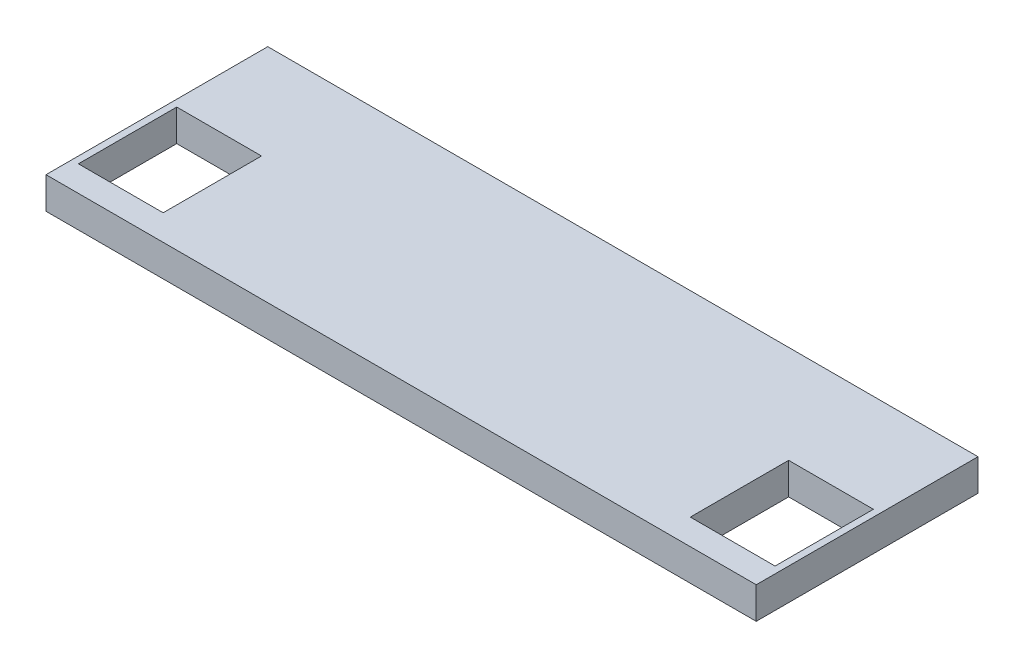
ISO-10303-21;
HEADER;
FILE_DESCRIPTION(('STEP AP214'),'2;1');
FILE_NAME('part.step','',(''),(''),'','','');
FILE_SCHEMA(('AUTOMOTIVE_DESIGN { 1 0 10303 214 1 1 1 1 }'));
ENDSEC;
DATA;
#1=APPLICATION_CONTEXT('core data for automotive mechanical design processes');
#2=APPLICATION_PROTOCOL_DEFINITION('international standard','automotive_design',2000,#1);
#3=PRODUCT_CONTEXT('',#1,'mechanical');
#4=PRODUCT('Part','Part','',(#3));
#5=PRODUCT_RELATED_PRODUCT_CATEGORY('part','',(#4));
#6=PRODUCT_DEFINITION_FORMATION('','',#4);
#7=PRODUCT_DEFINITION_CONTEXT('part definition',#1,'design');
#8=PRODUCT_DEFINITION('design','',#6,#7);
#9=PRODUCT_DEFINITION_SHAPE('','',#8);
#10=(LENGTH_UNIT() NAMED_UNIT(*) SI_UNIT(.MILLI.,.METRE.));
#11=(NAMED_UNIT(*) PLANE_ANGLE_UNIT() SI_UNIT($,.RADIAN.));
#12=(NAMED_UNIT(*) SI_UNIT($,.STERADIAN.) SOLID_ANGLE_UNIT());
#13=UNCERTAINTY_MEASURE_WITH_UNIT(LENGTH_MEASURE(1.E-05),#10,'distance_accuracy_value','');
#14=(GEOMETRIC_REPRESENTATION_CONTEXT(3) GLOBAL_UNCERTAINTY_ASSIGNED_CONTEXT((#13)) GLOBAL_UNIT_ASSIGNED_CONTEXT((#10,
#11,#12)) REPRESENTATION_CONTEXT('',''));
#15=CARTESIAN_POINT('',(0.,0.,0.));
#16=DIRECTION('',(0.,0.,1.));
#17=DIRECTION('',(1.,0.,0.));
#18=AXIS2_PLACEMENT_3D('',#15,#16,#17);
#19=CARTESIAN_POINT('',(0.,2.3749,0.));
#20=DIRECTION('',(0.,1.,0.));
#21=DIRECTION('',(0.,0.,1.));
#22=AXIS2_PLACEMENT_3D('',#19,#20,#21);
#23=PLANE('',#22);
#24=DIRECTION('',(0.,0.,-1.));
#25=VECTOR('',#24,1.);
#26=CARTESIAN_POINT('',(19.74215,2.3749,0.));
#27=LINE('',#26,#25);
#28=CARTESIAN_POINT('',(19.74215,2.3749,-1.91896999999999));
#29=VERTEX_POINT('',#28);
#30=CARTESIAN_POINT('',(19.74215,2.3749,-9.28496999999999));
#31=VERTEX_POINT('',#30);
#32=EDGE_CURVE('E263',#29,#31,#27,.T.);
#33=ORIENTED_EDGE('',*,*,#32,.T.);
#34=DIRECTION('',(1.,0.,0.));
#35=VECTOR('',#34,1.);
#36=CARTESIAN_POINT('',(0.,2.3749,-9.28496999999999));
#37=LINE('',#36,#35);
#38=CARTESIAN_POINT('',(26.09215,2.3749,-9.28496999999999));
#39=VERTEX_POINT('',#38);
#40=EDGE_CURVE('E273',#31,#39,#37,.T.);
#41=ORIENTED_EDGE('',*,*,#40,.T.);
#42=DIRECTION('',(0.,0.,-1.));
#43=VECTOR('',#42,1.);
#44=CARTESIAN_POINT('',(26.09215,2.3749,0.));
#45=LINE('',#44,#43);
#46=CARTESIAN_POINT('',(26.09215,2.3749,-1.91896999999999));
#47=VERTEX_POINT('',#46);
#48=EDGE_CURVE('E267',#47,#39,#45,.T.);
#49=ORIENTED_EDGE('',*,*,#48,.F.);
#50=DIRECTION('',(1.,0.,0.));
#51=VECTOR('',#50,1.);
#52=CARTESIAN_POINT('',(0.,2.3749,-1.91896999999999));
#53=LINE('',#52,#51);
#54=EDGE_CURVE('E262',#29,#47,#53,.T.);
#55=ORIENTED_EDGE('',*,*,#54,.F.);
#56=EDGE_LOOP('',(#33,#41,#49,#55));
#57=FACE_BOUND('',#56,.T.);
#58=DIRECTION('',(0.,0.,-1.));
#59=VECTOR('',#58,1.);
#60=CARTESIAN_POINT('',(26.60015,2.3749,0.));
#61=LINE('',#60,#59);
#62=CARTESIAN_POINT('',(26.60015,2.3749,0.));
#63=VERTEX_POINT('',#62);
#64=CARTESIAN_POINT('',(26.60015,2.3749,-16.6116));
#65=VERTEX_POINT('',#64);
#66=EDGE_CURVE('E305',#63,#65,#61,.T.);
#67=ORIENTED_EDGE('',*,*,#66,.T.);
#68=DIRECTION('',(-1.,0.,0.));
#69=VECTOR('',#68,1.);
#70=CARTESIAN_POINT('',(26.60015,2.3749,-16.6116));
#71=LINE('',#70,#69);
#72=CARTESIAN_POINT('',(-26.60015,2.3749,-16.6116));
#73=VERTEX_POINT('',#72);
#74=EDGE_CURVE('E306',#65,#73,#71,.T.);
#75=ORIENTED_EDGE('',*,*,#74,.T.);
#76=DIRECTION('',(0.,0.,1.));
#77=VECTOR('',#76,1.);
#78=CARTESIAN_POINT('',(-26.60015,2.3749,-16.6116));
#79=LINE('',#78,#77);
#80=CARTESIAN_POINT('',(-26.60015,2.3749,0.));
#81=VERTEX_POINT('',#80);
#82=EDGE_CURVE('E315',#73,#81,#79,.T.);
#83=ORIENTED_EDGE('',*,*,#82,.T.);
#84=DIRECTION('',(1.,0.,0.));
#85=VECTOR('',#84,1.);
#86=CARTESIAN_POINT('',(-26.60015,2.3749,0.));
#87=LINE('',#86,#85);
#88=EDGE_CURVE('E314',#81,#63,#87,.T.);
#89=ORIENTED_EDGE('',*,*,#88,.T.);
#90=EDGE_LOOP('',(#67,#75,#83,#89));
#91=FACE_BOUND('',#90,.T.);
#92=DIRECTION('',(-1.,0.,0.));
#93=VECTOR('',#92,1.);
#94=CARTESIAN_POINT('',(0.,2.3749,-9.28496999999999));
#95=LINE('',#94,#93);
#96=CARTESIAN_POINT('',(-19.74215,2.3749,-9.28496999999999));
#97=VERTEX_POINT('',#96);
#98=CARTESIAN_POINT('',(-26.09215,2.3749,-9.28496999999999));
#99=VERTEX_POINT('',#98);
#100=EDGE_CURVE('E223',#97,#99,#95,.T.);
#101=ORIENTED_EDGE('',*,*,#100,.F.);
#102=DIRECTION('',(0.,0.,-1.));
#103=VECTOR('',#102,1.);
#104=CARTESIAN_POINT('',(-19.74215,2.3749,0.));
#105=LINE('',#104,#103);
#106=CARTESIAN_POINT('',(-19.74215,2.3749,-1.91896999999999));
#107=VERTEX_POINT('',#106);
#108=EDGE_CURVE('E211',#107,#97,#105,.T.);
#109=ORIENTED_EDGE('',*,*,#108,.F.);
#110=DIRECTION('',(-1.,0.,0.));
#111=VECTOR('',#110,1.);
#112=CARTESIAN_POINT('',(0.,2.3749,-1.91896999999999));
#113=LINE('',#112,#111);
#114=CARTESIAN_POINT('',(-26.09215,2.3749,-1.91896999999999));
#115=VERTEX_POINT('',#114);
#116=EDGE_CURVE('E239',#107,#115,#113,.T.);
#117=ORIENTED_EDGE('',*,*,#116,.T.);
#118=DIRECTION('',(0.,0.,-1.));
#119=VECTOR('',#118,1.);
#120=CARTESIAN_POINT('',(-26.09215,2.3749,0.));
#121=LINE('',#120,#119);
#122=EDGE_CURVE('E137',#115,#99,#121,.T.);
#123=ORIENTED_EDGE('',*,*,#122,.T.);
#124=EDGE_LOOP('',(#101,#109,#117,#123));
#125=FACE_BOUND('',#124,.T.);
#126=ADVANCED_FACE('F121',(#57,#91,#125),#23,.T.);
#127=CARTESIAN_POINT('',(0.,0.,0.));
#128=DIRECTION('',(0.,1.,0.));
#129=DIRECTION('',(0.,0.,1.));
#130=AXIS2_PLACEMENT_3D('',#127,#128,#129);
#131=PLANE('',#130);
#132=DIRECTION('',(0.,0.,-1.));
#133=VECTOR('',#132,1.);
#134=CARTESIAN_POINT('',(26.60015,0.,0.));
#135=LINE('',#134,#133);
#136=CARTESIAN_POINT('',(26.60015,0.,0.));
#137=VERTEX_POINT('',#136);
#138=CARTESIAN_POINT('',(26.60015,0.,-16.6116));
#139=VERTEX_POINT('',#138);
#140=EDGE_CURVE('E301',#137,#139,#135,.T.);
#141=ORIENTED_EDGE('',*,*,#140,.F.);
#142=DIRECTION('',(1.,0.,0.));
#143=VECTOR('',#142,1.);
#144=CARTESIAN_POINT('',(-26.60015,0.,0.));
#145=LINE('',#144,#143);
#146=CARTESIAN_POINT('',(-26.60015,0.,0.));
#147=VERTEX_POINT('',#146);
#148=EDGE_CURVE('E309',#147,#137,#145,.T.);
#149=ORIENTED_EDGE('',*,*,#148,.F.);
#150=DIRECTION('',(0.,0.,1.));
#151=VECTOR('',#150,1.);
#152=CARTESIAN_POINT('',(-26.60015,0.,-16.6116));
#153=LINE('',#152,#151);
#154=CARTESIAN_POINT('',(-26.60015,0.,-16.6116));
#155=VERTEX_POINT('',#154);
#156=EDGE_CURVE('E324',#155,#147,#153,.T.);
#157=ORIENTED_EDGE('',*,*,#156,.F.);
#158=DIRECTION('',(-1.,0.,0.));
#159=VECTOR('',#158,1.);
#160=CARTESIAN_POINT('',(26.60015,0.,-16.6116));
#161=LINE('',#160,#159);
#162=EDGE_CURVE('E325',#139,#155,#161,.T.);
#163=ORIENTED_EDGE('',*,*,#162,.F.);
#164=EDGE_LOOP('',(#141,#149,#157,#163));
#165=FACE_BOUND('',#164,.T.);
#166=DIRECTION('',(1.,0.,0.));
#167=VECTOR('',#166,1.);
#168=CARTESIAN_POINT('',(0.,0.,-9.28496999999999));
#169=LINE('',#168,#167);
#170=CARTESIAN_POINT('',(19.74215,0.,-9.28496999999999));
#171=VERTEX_POINT('',#170);
#172=CARTESIAN_POINT('',(26.09215,0.,-9.28496999999999));
#173=VERTEX_POINT('',#172);
#174=EDGE_CURVE('E266',#171,#173,#169,.T.);
#175=ORIENTED_EDGE('',*,*,#174,.F.);
#176=DIRECTION('',(0.,0.,-1.));
#177=VECTOR('',#176,1.);
#178=CARTESIAN_POINT('',(19.74215,0.,0.));
#179=LINE('',#178,#177);
#180=CARTESIAN_POINT('',(19.74215,0.,-1.91896999999999));
#181=VERTEX_POINT('',#180);
#182=EDGE_CURVE('E231',#181,#171,#179,.T.);
#183=ORIENTED_EDGE('',*,*,#182,.F.);
#184=DIRECTION('',(1.,0.,0.));
#185=VECTOR('',#184,1.);
#186=CARTESIAN_POINT('',(0.,0.,-1.91896999999999));
#187=LINE('',#186,#185);
#188=CARTESIAN_POINT('',(26.09215,0.,-1.91896999999999));
#189=VERTEX_POINT('',#188);
#190=EDGE_CURVE('E279',#181,#189,#187,.T.);
#191=ORIENTED_EDGE('',*,*,#190,.T.);
#192=DIRECTION('',(0.,0.,-1.));
#193=VECTOR('',#192,1.);
#194=CARTESIAN_POINT('',(26.09215,0.,0.));
#195=LINE('',#194,#193);
#196=EDGE_CURVE('E281',#189,#173,#195,.T.);
#197=ORIENTED_EDGE('',*,*,#196,.T.);
#198=EDGE_LOOP('',(#175,#183,#191,#197));
#199=FACE_BOUND('',#198,.T.);
#200=DIRECTION('',(0.,0.,-1.));
#201=VECTOR('',#200,1.);
#202=CARTESIAN_POINT('',(-19.74215,0.,0.));
#203=LINE('',#202,#201);
#204=CARTESIAN_POINT('',(-19.74215,0.,-1.91896999999999));
#205=VERTEX_POINT('',#204);
#206=CARTESIAN_POINT('',(-19.74215,0.,-9.28496999999999));
#207=VERTEX_POINT('',#206);
#208=EDGE_CURVE('E150',#205,#207,#203,.T.);
#209=ORIENTED_EDGE('',*,*,#208,.T.);
#210=DIRECTION('',(-1.,0.,0.));
#211=VECTOR('',#210,1.);
#212=CARTESIAN_POINT('',(0.,0.,-9.28496999999999));
#213=LINE('',#212,#211);
#214=CARTESIAN_POINT('',(-26.09215,0.,-9.28496999999999));
#215=VERTEX_POINT('',#214);
#216=EDGE_CURVE('E227',#207,#215,#213,.T.);
#217=ORIENTED_EDGE('',*,*,#216,.T.);
#218=DIRECTION('',(0.,0.,-1.));
#219=VECTOR('',#218,1.);
#220=CARTESIAN_POINT('',(-26.09215,0.,0.));
#221=LINE('',#220,#219);
#222=CARTESIAN_POINT('',(-26.09215,0.,-1.91896999999999));
#223=VERTEX_POINT('',#222);
#224=EDGE_CURVE('E250',#223,#215,#221,.T.);
#225=ORIENTED_EDGE('',*,*,#224,.F.);
#226=DIRECTION('',(-1.,0.,0.));
#227=VECTOR('',#226,1.);
#228=CARTESIAN_POINT('',(0.,0.,-1.91896999999999));
#229=LINE('',#228,#227);
#230=EDGE_CURVE('E222',#205,#223,#229,.T.);
#231=ORIENTED_EDGE('',*,*,#230,.F.);
#232=EDGE_LOOP('',(#209,#217,#225,#231));
#233=FACE_BOUND('',#232,.T.);
#234=ADVANCED_FACE('F350',(#165,#199,#233),#131,.F.);
#235=CARTESIAN_POINT('',(26.60015,2.3749,0.));
#236=DIRECTION('',(-1.,0.,0.));
#237=DIRECTION('',(0.,0.,1.));
#238=AXIS2_PLACEMENT_3D('',#235,#236,#237);
#239=PLANE('',#238);
#240=ORIENTED_EDGE('',*,*,#140,.T.);
#241=DIRECTION('',(0.,-1.,0.));
#242=VECTOR('',#241,1.);
#243=CARTESIAN_POINT('',(26.60015,2.3749,-16.6116));
#244=LINE('',#243,#242);
#245=EDGE_CURVE('E12',#65,#139,#244,.T.);
#246=ORIENTED_EDGE('',*,*,#245,.F.);
#247=ORIENTED_EDGE('',*,*,#66,.F.);
#248=DIRECTION('',(0.,-1.,0.));
#249=VECTOR('',#248,1.);
#250=CARTESIAN_POINT('',(26.60015,2.3749,0.));
#251=LINE('',#250,#249);
#252=EDGE_CURVE('E318',#63,#137,#251,.T.);
#253=ORIENTED_EDGE('',*,*,#252,.T.);
#254=EDGE_LOOP('',(#240,#246,#247,#253));
#255=FACE_BOUND('',#254,.T.);
#256=ADVANCED_FACE('F124',(#255),#239,.F.);
#257=CARTESIAN_POINT('',(26.60015,2.3749,-16.6116));
#258=DIRECTION('',(0.,0.,1.));
#259=DIRECTION('',(1.,0.,0.));
#260=AXIS2_PLACEMENT_3D('',#257,#258,#259);
#261=PLANE('',#260);
#262=ORIENTED_EDGE('',*,*,#162,.T.);
#263=DIRECTION('',(0.,-1.,0.));
#264=VECTOR('',#263,1.);
#265=CARTESIAN_POINT('',(-26.60015,2.3749,-16.6116));
#266=LINE('',#265,#264);
#267=EDGE_CURVE('E135',#73,#155,#266,.T.);
#268=ORIENTED_EDGE('',*,*,#267,.F.);
#269=ORIENTED_EDGE('',*,*,#74,.F.);
#270=ORIENTED_EDGE('',*,*,#245,.T.);
#271=EDGE_LOOP('',(#262,#268,#269,#270));
#272=FACE_BOUND('',#271,.T.);
#273=ADVANCED_FACE('F357',(#272),#261,.F.);
#274=CARTESIAN_POINT('',(-26.60015,2.3749,-16.6116));
#275=DIRECTION('',(1.,0.,0.));
#276=DIRECTION('',(0.,0.,-1.));
#277=AXIS2_PLACEMENT_3D('',#274,#275,#276);
#278=PLANE('',#277);
#279=ORIENTED_EDGE('',*,*,#156,.T.);
#280=DIRECTION('',(0.,-1.,0.));
#281=VECTOR('',#280,1.);
#282=CARTESIAN_POINT('',(-26.60015,2.3749,0.));
#283=LINE('',#282,#281);
#284=EDGE_CURVE('E331',#81,#147,#283,.T.);
#285=ORIENTED_EDGE('',*,*,#284,.F.);
#286=ORIENTED_EDGE('',*,*,#82,.F.);
#287=ORIENTED_EDGE('',*,*,#267,.T.);
#288=EDGE_LOOP('',(#279,#285,#286,#287));
#289=FACE_BOUND('',#288,.T.);
#290=ADVANCED_FACE('F341',(#289),#278,.F.);
#291=CARTESIAN_POINT('',(-26.60015,2.3749,0.));
#292=DIRECTION('',(0.,0.,-1.));
#293=DIRECTION('',(-1.,0.,0.));
#294=AXIS2_PLACEMENT_3D('',#291,#292,#293);
#295=PLANE('',#294);
#296=ORIENTED_EDGE('',*,*,#148,.T.);
#297=ORIENTED_EDGE('',*,*,#252,.F.);
#298=ORIENTED_EDGE('',*,*,#88,.F.);
#299=ORIENTED_EDGE('',*,*,#284,.T.);
#300=EDGE_LOOP('',(#296,#297,#298,#299));
#301=FACE_BOUND('',#300,.T.);
#302=ADVANCED_FACE('F351',(#301),#295,.F.);
#303=CARTESIAN_POINT('',(19.74215,2.3749,0.));
#304=DIRECTION('',(-1.,0.,0.));
#305=DIRECTION('',(0.,0.,1.));
#306=AXIS2_PLACEMENT_3D('',#303,#304,#305);
#307=PLANE('',#306);
#308=ORIENTED_EDGE('',*,*,#182,.T.);
#309=DIRECTION('',(0.,-1.,0.));
#310=VECTOR('',#309,1.);
#311=CARTESIAN_POINT('',(19.74215,2.3749,-9.28496999999999));
#312=LINE('',#311,#310);
#313=EDGE_CURVE('E280',#31,#171,#312,.T.);
#314=ORIENTED_EDGE('',*,*,#313,.F.);
#315=ORIENTED_EDGE('',*,*,#32,.F.);
#316=DIRECTION('',(0.,-1.,0.));
#317=VECTOR('',#316,1.);
#318=CARTESIAN_POINT('',(19.74215,2.3749,-1.91896999999999));
#319=LINE('',#318,#317);
#320=EDGE_CURVE('E299',#29,#181,#319,.T.);
#321=ORIENTED_EDGE('',*,*,#320,.T.);
#322=EDGE_LOOP('',(#308,#314,#315,#321));
#323=FACE_BOUND('',#322,.T.);
#324=ADVANCED_FACE('F371',(#323),#307,.F.);
#325=CARTESIAN_POINT('',(0.,2.3749,-1.91896999999999));
#326=DIRECTION('',(0.,0.,-1.));
#327=DIRECTION('',(-1.,0.,0.));
#328=AXIS2_PLACEMENT_3D('',#325,#326,#327);
#329=PLANE('',#328);
#330=ORIENTED_EDGE('',*,*,#190,.F.);
#331=ORIENTED_EDGE('',*,*,#320,.F.);
#332=ORIENTED_EDGE('',*,*,#54,.T.);
#333=DIRECTION('',(0.,-1.,0.));
#334=VECTOR('',#333,1.);
#335=CARTESIAN_POINT('',(26.09215,2.3749,-1.91896999999999));
#336=LINE('',#335,#334);
#337=EDGE_CURVE('E300',#47,#189,#336,.T.);
#338=ORIENTED_EDGE('',*,*,#337,.T.);
#339=EDGE_LOOP('',(#330,#331,#332,#338));
#340=FACE_BOUND('',#339,.T.);
#341=ADVANCED_FACE('F382',(#340),#329,.T.);
#342=CARTESIAN_POINT('',(26.09215,2.3749,0.));
#343=DIRECTION('',(-1.,0.,0.));
#344=DIRECTION('',(0.,0.,1.));
#345=AXIS2_PLACEMENT_3D('',#342,#343,#344);
#346=PLANE('',#345);
#347=ORIENTED_EDGE('',*,*,#196,.F.);
#348=ORIENTED_EDGE('',*,*,#337,.F.);
#349=ORIENTED_EDGE('',*,*,#48,.T.);
#350=DIRECTION('',(0.,-1.,0.));
#351=VECTOR('',#350,1.);
#352=CARTESIAN_POINT('',(26.09215,2.3749,-9.28496999999999));
#353=LINE('',#352,#351);
#354=EDGE_CURVE('E294',#39,#173,#353,.T.);
#355=ORIENTED_EDGE('',*,*,#354,.T.);
#356=EDGE_LOOP('',(#347,#348,#349,#355));
#357=FACE_BOUND('',#356,.T.);
#358=ADVANCED_FACE('F388',(#357),#346,.T.);
#359=CARTESIAN_POINT('',(0.,2.3749,-9.28496999999999));
#360=DIRECTION('',(0.,0.,-1.));
#361=DIRECTION('',(-1.,0.,0.));
#362=AXIS2_PLACEMENT_3D('',#359,#360,#361);
#363=PLANE('',#362);
#364=ORIENTED_EDGE('',*,*,#174,.T.);
#365=ORIENTED_EDGE('',*,*,#354,.F.);
#366=ORIENTED_EDGE('',*,*,#40,.F.);
#367=ORIENTED_EDGE('',*,*,#313,.T.);
#368=EDGE_LOOP('',(#364,#365,#366,#367));
#369=FACE_BOUND('',#368,.T.);
#370=ADVANCED_FACE('F395',(#369),#363,.F.);
#371=CARTESIAN_POINT('',(-19.74215,2.3749,0.));
#372=DIRECTION('',(-1.,0.,0.));
#373=DIRECTION('',(0.,0.,1.));
#374=AXIS2_PLACEMENT_3D('',#371,#372,#373);
#375=PLANE('',#374);
#376=ORIENTED_EDGE('',*,*,#208,.F.);
#377=DIRECTION('',(0.,-1.,0.));
#378=VECTOR('',#377,1.);
#379=CARTESIAN_POINT('',(-19.74215,2.3749,-1.91896999999999));
#380=LINE('',#379,#378);
#381=EDGE_CURVE('E220',#107,#205,#380,.T.);
#382=ORIENTED_EDGE('',*,*,#381,.F.);
#383=ORIENTED_EDGE('',*,*,#108,.T.);
#384=DIRECTION('',(0.,-1.,0.));
#385=VECTOR('',#384,1.);
#386=CARTESIAN_POINT('',(-19.74215,2.3749,-9.28496999999999));
#387=LINE('',#386,#385);
#388=EDGE_CURVE('E218',#97,#207,#387,.T.);
#389=ORIENTED_EDGE('',*,*,#388,.T.);
#390=EDGE_LOOP('',(#376,#382,#383,#389));
#391=FACE_BOUND('',#390,.T.);
#392=ADVANCED_FACE('F214',(#391),#375,.T.);
#393=CARTESIAN_POINT('',(0.,2.3749,-9.28496999999999));
#394=DIRECTION('',(0.,0.,1.));
#395=DIRECTION('',(1.,0.,0.));
#396=AXIS2_PLACEMENT_3D('',#393,#394,#395);
#397=PLANE('',#396);
#398=ORIENTED_EDGE('',*,*,#216,.F.);
#399=ORIENTED_EDGE('',*,*,#388,.F.);
#400=ORIENTED_EDGE('',*,*,#100,.T.);
#401=DIRECTION('',(0.,-1.,0.));
#402=VECTOR('',#401,1.);
#403=CARTESIAN_POINT('',(-26.09215,2.3749,-9.28496999999999));
#404=LINE('',#403,#402);
#405=EDGE_CURVE('E235',#99,#215,#404,.T.);
#406=ORIENTED_EDGE('',*,*,#405,.T.);
#407=EDGE_LOOP('',(#398,#399,#400,#406));
#408=FACE_BOUND('',#407,.T.);
#409=ADVANCED_FACE('F230',(#408),#397,.T.);
#410=CARTESIAN_POINT('',(-26.09215,2.3749,0.));
#411=DIRECTION('',(-1.,0.,0.));
#412=DIRECTION('',(0.,0.,1.));
#413=AXIS2_PLACEMENT_3D('',#410,#411,#412);
#414=PLANE('',#413);
#415=ORIENTED_EDGE('',*,*,#224,.T.);
#416=ORIENTED_EDGE('',*,*,#405,.F.);
#417=ORIENTED_EDGE('',*,*,#122,.F.);
#418=DIRECTION('',(0.,-1.,0.));
#419=VECTOR('',#418,1.);
#420=CARTESIAN_POINT('',(-26.09215,2.3749,-1.91896999999999));
#421=LINE('',#420,#419);
#422=EDGE_CURVE('E258',#115,#223,#421,.T.);
#423=ORIENTED_EDGE('',*,*,#422,.T.);
#424=EDGE_LOOP('',(#415,#416,#417,#423));
#425=FACE_BOUND('',#424,.T.);
#426=ADVANCED_FACE('F415',(#425),#414,.F.);
#427=CARTESIAN_POINT('',(0.,2.3749,-1.91896999999999));
#428=DIRECTION('',(0.,0.,1.));
#429=DIRECTION('',(1.,0.,0.));
#430=AXIS2_PLACEMENT_3D('',#427,#428,#429);
#431=PLANE('',#430);
#432=ORIENTED_EDGE('',*,*,#230,.T.);
#433=ORIENTED_EDGE('',*,*,#422,.F.);
#434=ORIENTED_EDGE('',*,*,#116,.F.);
#435=ORIENTED_EDGE('',*,*,#381,.T.);
#436=EDGE_LOOP('',(#432,#433,#434,#435));
#437=FACE_BOUND('',#436,.T.);
#438=ADVANCED_FACE('F414',(#437),#431,.F.);
#439=CLOSED_SHELL('',(#126,#234,#256,#273,#290,#302,#324,#341,#358,#370,#392,#409,#426,#438));
#440=MANIFOLD_SOLID_BREP('B2',#439);
#441=ADVANCED_BREP_SHAPE_REPRESENTATION('',(#18,#440),#14);
#442=SHAPE_DEFINITION_REPRESENTATION(#9,#441);
ENDSEC;
END-ISO-10303-21;
